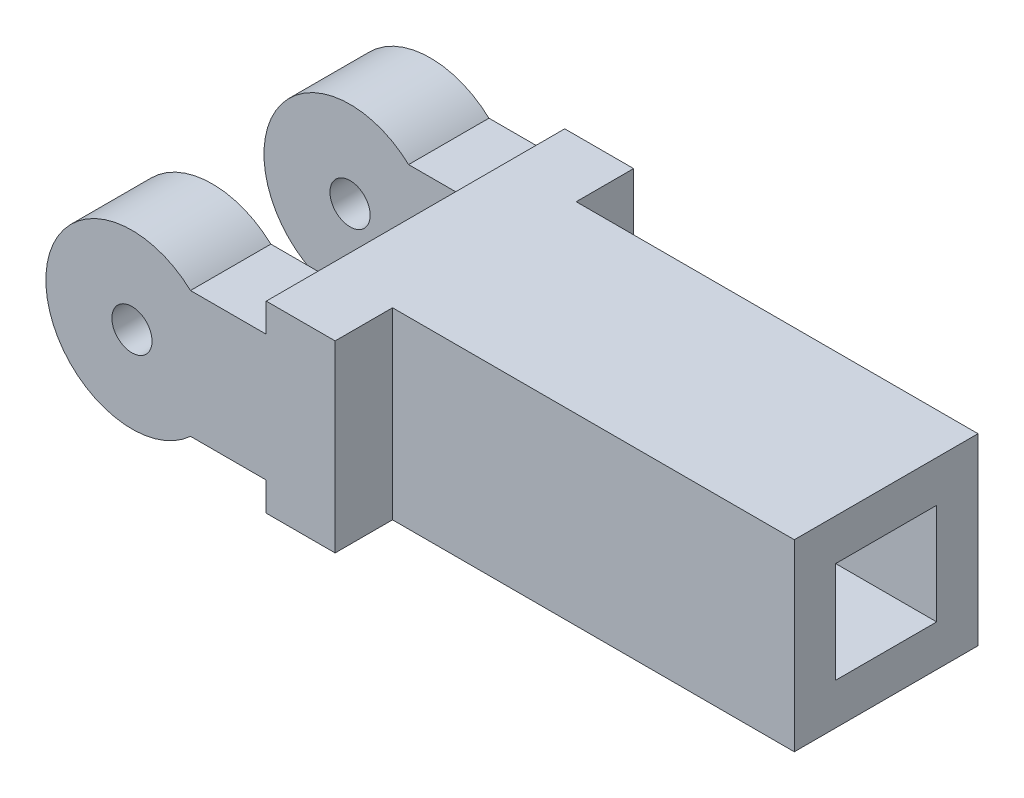
ISO-10303-21;
HEADER;
FILE_DESCRIPTION(('STEP AP214'),'2;1');
FILE_NAME('part.step','',(''),(''),'','','');
FILE_SCHEMA(('AUTOMOTIVE_DESIGN { 1 0 10303 214 1 1 1 1 }'));
ENDSEC;
DATA;
#1=APPLICATION_CONTEXT('core data for automotive mechanical design processes');
#2=APPLICATION_PROTOCOL_DEFINITION('international standard','automotive_design',2000,#1);
#3=PRODUCT_CONTEXT('',#1,'mechanical');
#4=PRODUCT('Part','Part','',(#3));
#5=PRODUCT_RELATED_PRODUCT_CATEGORY('part','',(#4));
#6=PRODUCT_DEFINITION_FORMATION('','',#4);
#7=PRODUCT_DEFINITION_CONTEXT('part definition',#1,'design');
#8=PRODUCT_DEFINITION('design','',#6,#7);
#9=PRODUCT_DEFINITION_SHAPE('','',#8);
#10=(LENGTH_UNIT() NAMED_UNIT(*) SI_UNIT(.MILLI.,.METRE.));
#11=(NAMED_UNIT(*) PLANE_ANGLE_UNIT() SI_UNIT($,.RADIAN.));
#12=(NAMED_UNIT(*) SI_UNIT($,.STERADIAN.) SOLID_ANGLE_UNIT());
#13=UNCERTAINTY_MEASURE_WITH_UNIT(LENGTH_MEASURE(1.E-05),#10,'distance_accuracy_value','');
#14=(GEOMETRIC_REPRESENTATION_CONTEXT(3) GLOBAL_UNCERTAINTY_ASSIGNED_CONTEXT((#13)) GLOBAL_UNIT_ASSIGNED_CONTEXT((#10,
#11,#12)) REPRESENTATION_CONTEXT('',''));
#15=CARTESIAN_POINT('',(0.,0.,0.));
#16=DIRECTION('',(0.,0.,1.));
#17=DIRECTION('',(1.,0.,0.));
#18=AXIS2_PLACEMENT_3D('',#15,#16,#17);
#19=CARTESIAN_POINT('',(7.,-1.6,-1.6));
#20=DIRECTION('',(0.,0.,1.));
#21=DIRECTION('',(1.,0.,0.));
#22=AXIS2_PLACEMENT_3D('',#19,#20,#21);
#23=PLANE('',#22);
#24=DIRECTION('',(0.,-1.,0.));
#25=VECTOR('',#24,1.);
#26=CARTESIAN_POINT('',(0.,-1.6,-1.6));
#27=LINE('',#26,#25);
#28=CARTESIAN_POINT('',(0.,1.6,-1.6));
#29=VERTEX_POINT('',#28);
#30=CARTESIAN_POINT('',(0.,-1.6,-1.6));
#31=VERTEX_POINT('',#30);
#32=EDGE_CURVE('E205',#29,#31,#27,.T.);
#33=ORIENTED_EDGE('',*,*,#32,.F.);
#34=DIRECTION('',(-1.,0.,0.));
#35=VECTOR('',#34,1.);
#36=CARTESIAN_POINT('',(7.,1.6,-1.6));
#37=LINE('',#36,#35);
#38=CARTESIAN_POINT('',(7.,1.6,-1.6));
#39=VERTEX_POINT('',#38);
#40=EDGE_CURVE('E182',#39,#29,#37,.T.);
#41=ORIENTED_EDGE('',*,*,#40,.F.);
#42=DIRECTION('',(0.,1.,0.));
#43=VECTOR('',#42,1.);
#44=CARTESIAN_POINT('',(7.,-1.6,-1.6));
#45=LINE('',#44,#43);
#46=CARTESIAN_POINT('',(7.,-1.6,-1.6));
#47=VERTEX_POINT('',#46);
#48=EDGE_CURVE('E297',#47,#39,#45,.T.);
#49=ORIENTED_EDGE('',*,*,#48,.F.);
#50=DIRECTION('',(-1.,0.,0.));
#51=VECTOR('',#50,1.);
#52=CARTESIAN_POINT('',(7.,-1.6,-1.6));
#53=LINE('',#52,#51);
#54=EDGE_CURVE('E306',#47,#31,#53,.T.);
#55=ORIENTED_EDGE('',*,*,#54,.T.);
#56=EDGE_LOOP('',(#33,#41,#49,#55));
#57=FACE_BOUND('',#56,.T.);
#58=ADVANCED_FACE('F37',(#57),#23,.F.);
#59=CARTESIAN_POINT('',(7.,-1.6,1.6));
#60=DIRECTION('',(0.,0.,-1.));
#61=DIRECTION('',(-1.,0.,0.));
#62=AXIS2_PLACEMENT_3D('',#59,#60,#61);
#63=PLANE('',#62);
#64=DIRECTION('',(0.,1.,0.));
#65=VECTOR('',#64,1.);
#66=CARTESIAN_POINT('',(0.,-1.6,1.6));
#67=LINE('',#66,#65);
#68=CARTESIAN_POINT('',(0.,-1.6,1.6));
#69=VERTEX_POINT('',#68);
#70=CARTESIAN_POINT('',(0.,1.6,1.6));
#71=VERTEX_POINT('',#70);
#72=EDGE_CURVE('E58',#69,#71,#67,.T.);
#73=ORIENTED_EDGE('',*,*,#72,.F.);
#74=DIRECTION('',(-1.,0.,0.));
#75=VECTOR('',#74,1.);
#76=CARTESIAN_POINT('',(7.,-1.6,1.6));
#77=LINE('',#76,#75);
#78=CARTESIAN_POINT('',(7.,-1.6,1.6));
#79=VERTEX_POINT('',#78);
#80=EDGE_CURVE('E309',#79,#69,#77,.T.);
#81=ORIENTED_EDGE('',*,*,#80,.F.);
#82=DIRECTION('',(0.,-1.,0.));
#83=VECTOR('',#82,1.);
#84=CARTESIAN_POINT('',(7.,-1.6,1.6));
#85=LINE('',#84,#83);
#86=CARTESIAN_POINT('',(7.,1.6,1.6));
#87=VERTEX_POINT('',#86);
#88=EDGE_CURVE('E302',#87,#79,#85,.T.);
#89=ORIENTED_EDGE('',*,*,#88,.F.);
#90=DIRECTION('',(-1.,0.,0.));
#91=VECTOR('',#90,1.);
#92=CARTESIAN_POINT('',(7.,1.6,1.6));
#93=LINE('',#92,#91);
#94=EDGE_CURVE('E54',#87,#71,#93,.T.);
#95=ORIENTED_EDGE('',*,*,#94,.T.);
#96=EDGE_LOOP('',(#73,#81,#89,#95));
#97=FACE_BOUND('',#96,.T.);
#98=ADVANCED_FACE('F383',(#97),#63,.F.);
#99=CARTESIAN_POINT('',(0.,1.1,-2.6));
#100=DIRECTION('',(0.,1.,0.));
#101=DIRECTION('',(-1.,0.,0.));
#102=AXIS2_PLACEMENT_3D('',#99,#100,#101);
#103=PLANE('',#102);
#104=DIRECTION('',(0.,0.,1.));
#105=VECTOR('',#104,1.);
#106=CARTESIAN_POINT('',(-2.52,1.1,-2.6));
#107=LINE('',#106,#105);
#108=CARTESIAN_POINT('',(-2.52,1.1,-2.6));
#109=VERTEX_POINT('',#108);
#110=CARTESIAN_POINT('',(-2.52,1.1,-1.2));
#111=VERTEX_POINT('',#110);
#112=EDGE_CURVE('E261',#109,#111,#107,.T.);
#113=ORIENTED_EDGE('',*,*,#112,.T.);
#114=DIRECTION('',(-1.,0.,0.));
#115=VECTOR('',#114,1.);
#116=CARTESIAN_POINT('',(-1.2,1.1,-1.2));
#117=LINE('',#116,#115);
#118=CARTESIAN_POINT('',(-1.2,1.1,-1.2));
#119=VERTEX_POINT('',#118);
#120=EDGE_CURVE('E216',#119,#111,#117,.T.);
#121=ORIENTED_EDGE('',*,*,#120,.F.);
#122=DIRECTION('',(0.,0.,1.));
#123=VECTOR('',#122,1.);
#124=CARTESIAN_POINT('',(-1.2,1.1,-2.6));
#125=LINE('',#124,#123);
#126=CARTESIAN_POINT('',(-1.2,1.1,-2.6));
#127=VERTEX_POINT('',#126);
#128=EDGE_CURVE('E45',#127,#119,#125,.T.);
#129=ORIENTED_EDGE('',*,*,#128,.F.);
#130=DIRECTION('',(-1.,0.,0.));
#131=VECTOR('',#130,1.);
#132=CARTESIAN_POINT('',(0.,1.1,-2.6));
#133=LINE('',#132,#131);
#134=EDGE_CURVE('E235',#127,#109,#133,.T.);
#135=ORIENTED_EDGE('',*,*,#134,.T.);
#136=EDGE_LOOP('',(#113,#121,#129,#135));
#137=FACE_BOUND('',#136,.T.);
#138=ADVANCED_FACE('F316',(#137),#103,.T.);
#139=CARTESIAN_POINT('',(0.,-1.1,-2.6));
#140=DIRECTION('',(0.,1.,0.));
#141=DIRECTION('',(0.,0.,1.));
#142=AXIS2_PLACEMENT_3D('',#139,#140,#141);
#143=PLANE('',#142);
#144=DIRECTION('',(1.,0.,0.));
#145=VECTOR('',#144,1.);
#146=CARTESIAN_POINT('',(-2.52,-1.1,-1.2));
#147=LINE('',#146,#145);
#148=CARTESIAN_POINT('',(-2.52,-1.1,-1.2));
#149=VERTEX_POINT('',#148);
#150=CARTESIAN_POINT('',(-1.2,-1.1,-1.2));
#151=VERTEX_POINT('',#150);
#152=EDGE_CURVE('E221',#149,#151,#147,.T.);
#153=ORIENTED_EDGE('',*,*,#152,.F.);
#154=DIRECTION('',(0.,0.,1.));
#155=VECTOR('',#154,1.);
#156=CARTESIAN_POINT('',(-2.52,-1.1,-2.6));
#157=LINE('',#156,#155);
#158=CARTESIAN_POINT('',(-2.52,-1.1,-2.6));
#159=VERTEX_POINT('',#158);
#160=EDGE_CURVE('E257',#159,#149,#157,.T.);
#161=ORIENTED_EDGE('',*,*,#160,.F.);
#162=DIRECTION('',(-1.,0.,0.));
#163=VECTOR('',#162,1.);
#164=CARTESIAN_POINT('',(0.,-1.1,-2.6));
#165=LINE('',#164,#163);
#166=CARTESIAN_POINT('',(-1.2,-1.1,-2.6));
#167=VERTEX_POINT('',#166);
#168=EDGE_CURVE('E242',#167,#159,#165,.T.);
#169=ORIENTED_EDGE('',*,*,#168,.F.);
#170=DIRECTION('',(0.,0.,1.));
#171=VECTOR('',#170,1.);
#172=CARTESIAN_POINT('',(-1.2,-1.1,-2.6));
#173=LINE('',#172,#171);
#174=EDGE_CURVE('E11',#167,#151,#173,.T.);
#175=ORIENTED_EDGE('',*,*,#174,.T.);
#176=EDGE_LOOP('',(#153,#161,#169,#175));
#177=FACE_BOUND('',#176,.T.);
#178=ADVANCED_FACE('F327',(#177),#143,.F.);
#179=CARTESIAN_POINT('',(-3.53980390271856,0.,-2.6));
#180=DIRECTION('',(0.,0.,1.));
#181=DIRECTION('',(1.,0.,0.));
#182=AXIS2_PLACEMENT_3D('',#179,#180,#181);
#183=CYLINDRICAL_SURFACE('',#182,1.5);
#184=ORIENTED_EDGE('',*,*,#160,.T.);
#185=CARTESIAN_POINT('',(-3.53980390271856,0.,-1.2));
#186=DIRECTION('',(0.,0.,1.));
#187=DIRECTION('',(1.,0.,0.));
#188=AXIS2_PLACEMENT_3D('',#185,#186,#187);
#189=CIRCLE('',#188,1.5);
#190=EDGE_CURVE('E219',#111,#149,#189,.T.);
#191=ORIENTED_EDGE('',*,*,#190,.F.);
#192=ORIENTED_EDGE('',*,*,#112,.F.);
#193=CARTESIAN_POINT('',(-3.53980390271856,0.,-2.6));
#194=DIRECTION('',(0.,0.,1.));
#195=DIRECTION('',(1.,0.,0.));
#196=AXIS2_PLACEMENT_3D('',#193,#194,#195);
#197=CIRCLE('',#196,1.5);
#198=EDGE_CURVE('E238',#109,#159,#197,.T.);
#199=ORIENTED_EDGE('',*,*,#198,.T.);
#200=EDGE_LOOP('',(#184,#191,#192,#199));
#201=FACE_BOUND('',#200,.T.);
#202=ADVANCED_FACE('F322',(#201),#183,.T.);
#203=CARTESIAN_POINT('',(7.,0.,0.));
#204=DIRECTION('',(-1.,0.,0.));
#205=DIRECTION('',(0.,0.,1.));
#206=AXIS2_PLACEMENT_3D('',#203,#204,#205);
#207=PLANE('',#206);
#208=ORIENTED_EDGE('',*,*,#48,.T.);
#209=DIRECTION('',(0.,0.,1.));
#210=VECTOR('',#209,1.);
#211=CARTESIAN_POINT('',(7.,1.6,1.6));
#212=LINE('',#211,#210);
#213=EDGE_CURVE('E300',#39,#87,#212,.T.);
#214=ORIENTED_EDGE('',*,*,#213,.T.);
#215=ORIENTED_EDGE('',*,*,#88,.T.);
#216=DIRECTION('',(0.,0.,-1.));
#217=VECTOR('',#216,1.);
#218=CARTESIAN_POINT('',(7.,-1.6,1.6));
#219=LINE('',#218,#217);
#220=EDGE_CURVE('E304',#79,#47,#219,.T.);
#221=ORIENTED_EDGE('',*,*,#220,.T.);
#222=EDGE_LOOP('',(#208,#214,#215,#221));
#223=FACE_BOUND('',#222,.T.);
#224=DIRECTION('',(0.,1.,0.));
#225=VECTOR('',#224,1.);
#226=CARTESIAN_POINT('',(7.,-0.88,-0.88));
#227=LINE('',#226,#225);
#228=CARTESIAN_POINT('',(7.,-0.88,-0.88));
#229=VERTEX_POINT('',#228);
#230=CARTESIAN_POINT('',(7.,0.88,-0.88));
#231=VERTEX_POINT('',#230);
#232=EDGE_CURVE('E268',#229,#231,#227,.T.);
#233=ORIENTED_EDGE('',*,*,#232,.F.);
#234=DIRECTION('',(0.,0.,-1.));
#235=VECTOR('',#234,1.);
#236=CARTESIAN_POINT('',(7.,-0.88,0.880000000000001));
#237=LINE('',#236,#235);
#238=CARTESIAN_POINT('',(7.,-0.88,0.880000000000001));
#239=VERTEX_POINT('',#238);
#240=EDGE_CURVE('E276',#239,#229,#237,.T.);
#241=ORIENTED_EDGE('',*,*,#240,.F.);
#242=DIRECTION('',(0.,-1.,0.));
#243=VECTOR('',#242,1.);
#244=CARTESIAN_POINT('',(7.,-0.88,0.880000000000001));
#245=LINE('',#244,#243);
#246=CARTESIAN_POINT('',(7.,0.88,0.880000000000001));
#247=VERTEX_POINT('',#246);
#248=EDGE_CURVE('E273',#247,#239,#245,.T.);
#249=ORIENTED_EDGE('',*,*,#248,.F.);
#250=DIRECTION('',(0.,0.,1.));
#251=VECTOR('',#250,1.);
#252=CARTESIAN_POINT('',(7.,0.88,0.880000000000001));
#253=LINE('',#252,#251);
#254=EDGE_CURVE('E270',#231,#247,#253,.T.);
#255=ORIENTED_EDGE('',*,*,#254,.F.);
#256=EDGE_LOOP('',(#233,#241,#249,#255));
#257=FACE_BOUND('',#256,.T.);
#258=ADVANCED_FACE('F393',(#223,#257),#207,.F.);
#259=CARTESIAN_POINT('',(7.,1.6,1.6));
#260=DIRECTION('',(0.,-1.,0.));
#261=DIRECTION('',(0.,0.,-1.));
#262=AXIS2_PLACEMENT_3D('',#259,#260,#261);
#263=PLANE('',#262);
#264=DIRECTION('',(0.,0.,-1.));
#265=VECTOR('',#264,1.);
#266=CARTESIAN_POINT('',(-1.2,1.6,1.6));
#267=LINE('',#266,#265);
#268=CARTESIAN_POINT('',(-1.2,1.6,2.6));
#269=VERTEX_POINT('',#268);
#270=CARTESIAN_POINT('',(-1.2,1.6,-2.6));
#271=VERTEX_POINT('',#270);
#272=EDGE_CURVE('E254',#269,#271,#267,.T.);
#273=ORIENTED_EDGE('',*,*,#272,.F.);
#274=DIRECTION('',(-1.,0.,0.));
#275=VECTOR('',#274,1.);
#276=CARTESIAN_POINT('',(0.,1.6,2.6));
#277=LINE('',#276,#275);
#278=CARTESIAN_POINT('',(0.,1.6,2.6));
#279=VERTEX_POINT('',#278);
#280=EDGE_CURVE('E203',#279,#269,#277,.T.);
#281=ORIENTED_EDGE('',*,*,#280,.F.);
#282=DIRECTION('',(0.,0.,1.));
#283=VECTOR('',#282,1.);
#284=CARTESIAN_POINT('',(0.,1.6,2.6));
#285=LINE('',#284,#283);
#286=EDGE_CURVE('E186',#71,#279,#285,.T.);
#287=ORIENTED_EDGE('',*,*,#286,.F.);
#288=ORIENTED_EDGE('',*,*,#94,.F.);
#289=ORIENTED_EDGE('',*,*,#213,.F.);
#290=ORIENTED_EDGE('',*,*,#40,.T.);
#291=CARTESIAN_POINT('',(0.,1.6,-2.6));
#292=VERTEX_POINT('',#291);
#293=EDGE_CURVE('E176',#292,#29,#285,.T.);
#294=ORIENTED_EDGE('',*,*,#293,.F.);
#295=DIRECTION('',(-1.,0.,0.));
#296=VECTOR('',#295,1.);
#297=CARTESIAN_POINT('',(0.,1.6,-2.6));
#298=LINE('',#297,#296);
#299=EDGE_CURVE('E180',#292,#271,#298,.T.);
#300=ORIENTED_EDGE('',*,*,#299,.T.);
#301=EDGE_LOOP('',(#273,#281,#287,#288,#289,#290,#294,#300));
#302=FACE_BOUND('',#301,.T.);
#303=ADVANCED_FACE('F178',(#302),#263,.F.);
#304=CARTESIAN_POINT('',(7.,-1.6,1.6));
#305=DIRECTION('',(0.,1.,0.));
#306=DIRECTION('',(0.,0.,1.));
#307=AXIS2_PLACEMENT_3D('',#304,#305,#306);
#308=PLANE('',#307);
#309=DIRECTION('',(0.,0.,1.));
#310=VECTOR('',#309,1.);
#311=CARTESIAN_POINT('',(-1.2,-1.6,-1.6));
#312=LINE('',#311,#310);
#313=CARTESIAN_POINT('',(-1.2,-1.6,-2.6));
#314=VERTEX_POINT('',#313);
#315=CARTESIAN_POINT('',(-1.2,-1.6,2.6));
#316=VERTEX_POINT('',#315);
#317=EDGE_CURVE('E265',#314,#316,#312,.T.);
#318=ORIENTED_EDGE('',*,*,#317,.F.);
#319=DIRECTION('',(-1.,0.,0.));
#320=VECTOR('',#319,1.);
#321=CARTESIAN_POINT('',(0.,-1.6,-2.6));
#322=LINE('',#321,#320);
#323=CARTESIAN_POINT('',(0.,-1.6,-2.6));
#324=VERTEX_POINT('',#323);
#325=EDGE_CURVE('E331',#324,#314,#322,.T.);
#326=ORIENTED_EDGE('',*,*,#325,.F.);
#327=DIRECTION('',(0.,0.,-1.));
#328=VECTOR('',#327,1.);
#329=CARTESIAN_POINT('',(0.,-1.6,2.6));
#330=LINE('',#329,#328);
#331=EDGE_CURVE('E192',#31,#324,#330,.T.);
#332=ORIENTED_EDGE('',*,*,#331,.F.);
#333=ORIENTED_EDGE('',*,*,#54,.F.);
#334=ORIENTED_EDGE('',*,*,#220,.F.);
#335=ORIENTED_EDGE('',*,*,#80,.T.);
#336=CARTESIAN_POINT('',(0.,-1.6,2.6));
#337=VERTEX_POINT('',#336);
#338=EDGE_CURVE('E338',#337,#69,#330,.T.);
#339=ORIENTED_EDGE('',*,*,#338,.F.);
#340=DIRECTION('',(-1.,0.,0.));
#341=VECTOR('',#340,1.);
#342=CARTESIAN_POINT('',(0.,-1.6,2.6));
#343=LINE('',#342,#341);
#344=EDGE_CURVE('E208',#337,#316,#343,.T.);
#345=ORIENTED_EDGE('',*,*,#344,.T.);
#346=EDGE_LOOP('',(#318,#326,#332,#333,#334,#335,#339,#345));
#347=FACE_BOUND('',#346,.T.);
#348=ADVANCED_FACE('F346',(#347),#308,.F.);
#349=CARTESIAN_POINT('',(7.,-0.88,-0.88));
#350=DIRECTION('',(0.,0.,1.));
#351=DIRECTION('',(1.,0.,0.));
#352=AXIS2_PLACEMENT_3D('',#349,#350,#351);
#353=PLANE('',#352);
#354=DIRECTION('',(0.,1.,0.));
#355=VECTOR('',#354,1.);
#356=CARTESIAN_POINT('',(0.,-0.88,-0.88));
#357=LINE('',#356,#355);
#358=CARTESIAN_POINT('',(0.,-0.88,-0.88));
#359=VERTEX_POINT('',#358);
#360=CARTESIAN_POINT('',(0.,0.88,-0.88));
#361=VERTEX_POINT('',#360);
#362=EDGE_CURVE('E267',#359,#361,#357,.T.);
#363=ORIENTED_EDGE('',*,*,#362,.F.);
#364=DIRECTION('',(-1.,0.,0.));
#365=VECTOR('',#364,1.);
#366=CARTESIAN_POINT('',(7.,-0.88,-0.88));
#367=LINE('',#366,#365);
#368=EDGE_CURVE('E278',#229,#359,#367,.T.);
#369=ORIENTED_EDGE('',*,*,#368,.F.);
#370=ORIENTED_EDGE('',*,*,#232,.T.);
#371=DIRECTION('',(-1.,0.,0.));
#372=VECTOR('',#371,1.);
#373=CARTESIAN_POINT('',(7.,0.88,-0.88));
#374=LINE('',#373,#372);
#375=EDGE_CURVE('E294',#231,#361,#374,.T.);
#376=ORIENTED_EDGE('',*,*,#375,.T.);
#377=EDGE_LOOP('',(#363,#369,#370,#376));
#378=FACE_BOUND('',#377,.T.);
#379=ADVANCED_FACE('F405',(#378),#353,.T.);
#380=CARTESIAN_POINT('',(7.,0.88,0.880000000000001));
#381=DIRECTION('',(0.,-1.,0.));
#382=DIRECTION('',(0.,0.,-1.));
#383=AXIS2_PLACEMENT_3D('',#380,#381,#382);
#384=PLANE('',#383);
#385=DIRECTION('',(0.,0.,1.));
#386=VECTOR('',#385,1.);
#387=CARTESIAN_POINT('',(0.,0.88,0.880000000000001));
#388=LINE('',#387,#386);
#389=CARTESIAN_POINT('',(0.,0.88,0.880000000000001));
#390=VERTEX_POINT('',#389);
#391=EDGE_CURVE('E281',#361,#390,#388,.T.);
#392=ORIENTED_EDGE('',*,*,#391,.F.);
#393=ORIENTED_EDGE('',*,*,#375,.F.);
#394=ORIENTED_EDGE('',*,*,#254,.T.);
#395=DIRECTION('',(-1.,0.,0.));
#396=VECTOR('',#395,1.);
#397=CARTESIAN_POINT('',(7.,0.88,0.880000000000001));
#398=LINE('',#397,#396);
#399=EDGE_CURVE('E292',#247,#390,#398,.T.);
#400=ORIENTED_EDGE('',*,*,#399,.T.);
#401=EDGE_LOOP('',(#392,#393,#394,#400));
#402=FACE_BOUND('',#401,.T.);
#403=ADVANCED_FACE('F407',(#402),#384,.T.);
#404=CARTESIAN_POINT('',(7.,-0.88,0.880000000000001));
#405=DIRECTION('',(0.,0.,-1.));
#406=DIRECTION('',(-1.,0.,0.));
#407=AXIS2_PLACEMENT_3D('',#404,#405,#406);
#408=PLANE('',#407);
#409=DIRECTION('',(0.,-1.,0.));
#410=VECTOR('',#409,1.);
#411=CARTESIAN_POINT('',(0.,-0.88,0.880000000000001));
#412=LINE('',#411,#410);
#413=CARTESIAN_POINT('',(0.,-0.88,0.880000000000001));
#414=VERTEX_POINT('',#413);
#415=EDGE_CURVE('E284',#390,#414,#412,.T.);
#416=ORIENTED_EDGE('',*,*,#415,.F.);
#417=ORIENTED_EDGE('',*,*,#399,.F.);
#418=ORIENTED_EDGE('',*,*,#248,.T.);
#419=DIRECTION('',(-1.,0.,0.));
#420=VECTOR('',#419,1.);
#421=CARTESIAN_POINT('',(7.,-0.88,0.880000000000001));
#422=LINE('',#421,#420);
#423=EDGE_CURVE('E290',#239,#414,#422,.T.);
#424=ORIENTED_EDGE('',*,*,#423,.T.);
#425=EDGE_LOOP('',(#416,#417,#418,#424));
#426=FACE_BOUND('',#425,.T.);
#427=ADVANCED_FACE('F416',(#426),#408,.T.);
#428=CARTESIAN_POINT('',(7.,-0.88,0.880000000000001));
#429=DIRECTION('',(0.,1.,0.));
#430=DIRECTION('',(0.,0.,1.));
#431=AXIS2_PLACEMENT_3D('',#428,#429,#430);
#432=PLANE('',#431);
#433=DIRECTION('',(0.,0.,-1.));
#434=VECTOR('',#433,1.);
#435=CARTESIAN_POINT('',(0.,-0.88,0.880000000000001));
#436=LINE('',#435,#434);
#437=EDGE_CURVE('E271',#414,#359,#436,.T.);
#438=ORIENTED_EDGE('',*,*,#437,.F.);
#439=ORIENTED_EDGE('',*,*,#423,.F.);
#440=ORIENTED_EDGE('',*,*,#240,.T.);
#441=ORIENTED_EDGE('',*,*,#368,.T.);
#442=EDGE_LOOP('',(#438,#439,#440,#441));
#443=FACE_BOUND('',#442,.T.);
#444=ADVANCED_FACE('F414',(#443),#432,.T.);
#445=CARTESIAN_POINT('',(0.,0.,0.));
#446=DIRECTION('',(-1.,0.,0.));
#447=DIRECTION('',(0.,0.,1.));
#448=AXIS2_PLACEMENT_3D('',#445,#446,#447);
#449=PLANE('',#448);
#450=ORIENTED_EDGE('',*,*,#362,.T.);
#451=ORIENTED_EDGE('',*,*,#391,.T.);
#452=ORIENTED_EDGE('',*,*,#415,.T.);
#453=ORIENTED_EDGE('',*,*,#437,.T.);
#454=EDGE_LOOP('',(#450,#451,#452,#453));
#455=FACE_BOUND('',#454,.T.);
#456=ADVANCED_FACE('F411',(#455),#449,.F.);
#457=CARTESIAN_POINT('',(-1.2,0.,0.));
#458=DIRECTION('',(-1.,0.,0.));
#459=DIRECTION('',(0.,0.,1.));
#460=AXIS2_PLACEMENT_3D('',#457,#458,#459);
#461=PLANE('',#460);
#462=ORIENTED_EDGE('',*,*,#174,.F.);
#463=DIRECTION('',(0.,1.,0.));
#464=VECTOR('',#463,1.);
#465=CARTESIAN_POINT('',(-1.2,-1.6,-2.6));
#466=LINE('',#465,#464);
#467=EDGE_CURVE('E330',#314,#167,#466,.T.);
#468=ORIENTED_EDGE('',*,*,#467,.F.);
#469=ORIENTED_EDGE('',*,*,#317,.T.);
#470=DIRECTION('',(0.,-1.,0.));
#471=VECTOR('',#470,1.);
#472=CARTESIAN_POINT('',(-1.2,-1.6,2.6));
#473=LINE('',#472,#471);
#474=CARTESIAN_POINT('',(-1.2,-1.1,2.6));
#475=VERTEX_POINT('',#474);
#476=EDGE_CURVE('E332',#475,#316,#473,.T.);
#477=ORIENTED_EDGE('',*,*,#476,.F.);
#478=CARTESIAN_POINT('',(-1.2,-1.1,1.2));
#479=VERTEX_POINT('',#478);
#480=EDGE_CURVE('E47',#479,#475,#173,.T.);
#481=ORIENTED_EDGE('',*,*,#480,.F.);
#482=DIRECTION('',(0.,1.,0.));
#483=VECTOR('',#482,1.);
#484=CARTESIAN_POINT('',(-1.2,-1.1,1.2));
#485=LINE('',#484,#483);
#486=CARTESIAN_POINT('',(-1.2,1.1,1.2));
#487=VERTEX_POINT('',#486);
#488=EDGE_CURVE('E213',#479,#487,#485,.T.);
#489=ORIENTED_EDGE('',*,*,#488,.T.);
#490=CARTESIAN_POINT('',(-1.2,1.1,2.6));
#491=VERTEX_POINT('',#490);
#492=EDGE_CURVE('E252',#487,#491,#125,.T.);
#493=ORIENTED_EDGE('',*,*,#492,.T.);
#494=EDGE_CURVE('E196',#269,#491,#473,.T.);
#495=ORIENTED_EDGE('',*,*,#494,.F.);
#496=ORIENTED_EDGE('',*,*,#272,.T.);
#497=EDGE_CURVE('E202',#127,#271,#466,.T.);
#498=ORIENTED_EDGE('',*,*,#497,.F.);
#499=ORIENTED_EDGE('',*,*,#128,.T.);
#500=DIRECTION('',(0.,1.,0.));
#501=VECTOR('',#500,1.);
#502=CARTESIAN_POINT('',(-1.2,-1.1,-1.2));
#503=LINE('',#502,#501);
#504=EDGE_CURVE('E214',#151,#119,#503,.T.);
#505=ORIENTED_EDGE('',*,*,#504,.F.);
#506=EDGE_LOOP('',(#462,#468,#469,#477,#481,#489,#493,#495,#496,#498,#499,#505));
#507=FACE_BOUND('',#506,.T.);
#508=ADVANCED_FACE('F313',(#507),#461,.T.);
#509=DIRECTION('',(-1.,0.,0.));
#510=VECTOR('',#509,1.);
#511=CARTESIAN_POINT('',(-1.2,1.1,1.2));
#512=LINE('',#511,#510);
#513=CARTESIAN_POINT('',(-2.52,1.1,1.2));
#514=VERTEX_POINT('',#513);
#515=EDGE_CURVE('E227',#487,#514,#512,.T.);
#516=ORIENTED_EDGE('',*,*,#515,.T.);
#517=CARTESIAN_POINT('',(-2.52,1.1,2.6));
#518=VERTEX_POINT('',#517);
#519=EDGE_CURVE('E244',#514,#518,#107,.T.);
#520=ORIENTED_EDGE('',*,*,#519,.T.);
#521=DIRECTION('',(-1.,0.,0.));
#522=VECTOR('',#521,1.);
#523=CARTESIAN_POINT('',(0.,1.1,2.6));
#524=LINE('',#523,#522);
#525=EDGE_CURVE('E224',#491,#518,#524,.T.);
#526=ORIENTED_EDGE('',*,*,#525,.F.);
#527=ORIENTED_EDGE('',*,*,#492,.F.);
#528=EDGE_LOOP('',(#516,#520,#526,#527));
#529=FACE_BOUND('',#528,.T.);
#530=ADVANCED_FACE('F364',(#529),#103,.T.);
#531=CARTESIAN_POINT('',(-2.52,-1.1,1.2));
#532=VERTEX_POINT('',#531);
#533=CARTESIAN_POINT('',(-2.52,-1.1,2.6));
#534=VERTEX_POINT('',#533);
#535=EDGE_CURVE('E260',#532,#534,#157,.T.);
#536=ORIENTED_EDGE('',*,*,#535,.F.);
#537=DIRECTION('',(1.,0.,0.));
#538=VECTOR('',#537,1.);
#539=CARTESIAN_POINT('',(-2.52,-1.1,1.2));
#540=LINE('',#539,#538);
#541=EDGE_CURVE('E217',#532,#479,#540,.T.);
#542=ORIENTED_EDGE('',*,*,#541,.T.);
#543=ORIENTED_EDGE('',*,*,#480,.T.);
#544=DIRECTION('',(-1.,0.,0.));
#545=VECTOR('',#544,1.);
#546=CARTESIAN_POINT('',(0.,-1.1,2.6));
#547=LINE('',#546,#545);
#548=EDGE_CURVE('E239',#475,#534,#547,.T.);
#549=ORIENTED_EDGE('',*,*,#548,.T.);
#550=EDGE_LOOP('',(#536,#542,#543,#549));
#551=FACE_BOUND('',#550,.T.);
#552=ADVANCED_FACE('F358',(#551),#143,.F.);
#553=CARTESIAN_POINT('',(-3.53980390271856,0.,1.2));
#554=DIRECTION('',(0.,0.,1.));
#555=DIRECTION('',(1.,0.,0.));
#556=AXIS2_PLACEMENT_3D('',#553,#554,#555);
#557=CIRCLE('',#556,1.5);
#558=EDGE_CURVE('E230',#514,#532,#557,.T.);
#559=ORIENTED_EDGE('',*,*,#558,.T.);
#560=ORIENTED_EDGE('',*,*,#535,.T.);
#561=CARTESIAN_POINT('',(-3.53980390271856,0.,2.6));
#562=DIRECTION('',(0.,0.,1.));
#563=DIRECTION('',(1.,0.,0.));
#564=AXIS2_PLACEMENT_3D('',#561,#562,#563);
#565=CIRCLE('',#564,1.5);
#566=EDGE_CURVE('E247',#518,#534,#565,.T.);
#567=ORIENTED_EDGE('',*,*,#566,.F.);
#568=ORIENTED_EDGE('',*,*,#519,.F.);
#569=EDGE_LOOP('',(#559,#560,#567,#568));
#570=FACE_BOUND('',#569,.T.);
#571=ADVANCED_FACE('F361',(#570),#183,.T.);
#572=CARTESIAN_POINT('',(0.,0.,-2.6));
#573=DIRECTION('',(0.,0.,1.));
#574=DIRECTION('',(1.,0.,0.));
#575=AXIS2_PLACEMENT_3D('',#572,#573,#574);
#576=PLANE('',#575);
#577=CARTESIAN_POINT('',(-3.53980390271856,0.,-2.6));
#578=DIRECTION('',(0.,0.,-1.));
#579=DIRECTION('',(-1.,0.,0.));
#580=AXIS2_PLACEMENT_3D('',#577,#578,#579);
#581=CIRCLE('',#580,0.35);
#582=CARTESIAN_POINT('',(-3.88980390271856,0.,-2.6));
#583=VERTEX_POINT('',#582);
#584=EDGE_CURVE('E604',#583,#583,#581,.T.);
#585=ORIENTED_EDGE('',*,*,#584,.F.);
#586=EDGE_LOOP('',(#585));
#587=FACE_BOUND('',#586,.T.);
#588=ORIENTED_EDGE('',*,*,#134,.F.);
#589=ORIENTED_EDGE('',*,*,#497,.T.);
#590=ORIENTED_EDGE('',*,*,#299,.F.);
#591=DIRECTION('',(0.,1.,0.));
#592=VECTOR('',#591,1.);
#593=CARTESIAN_POINT('',(0.,-1.6,-2.6));
#594=LINE('',#593,#592);
#595=EDGE_CURVE('E189',#324,#292,#594,.T.);
#596=ORIENTED_EDGE('',*,*,#595,.F.);
#597=ORIENTED_EDGE('',*,*,#325,.T.);
#598=ORIENTED_EDGE('',*,*,#467,.T.);
#599=ORIENTED_EDGE('',*,*,#168,.T.);
#600=ORIENTED_EDGE('',*,*,#198,.F.);
#601=EDGE_LOOP('',(#588,#589,#590,#596,#597,#598,#599,#600));
#602=FACE_BOUND('',#601,.T.);
#603=ADVANCED_FACE('F200',(#587,#602),#576,.F.);
#604=CARTESIAN_POINT('',(0.,0.,2.6));
#605=DIRECTION('',(0.,0.,1.));
#606=DIRECTION('',(1.,0.,0.));
#607=AXIS2_PLACEMENT_3D('',#604,#605,#606);
#608=PLANE('',#607);
#609=CARTESIAN_POINT('',(-3.53980390271856,0.,2.6));
#610=DIRECTION('',(0.,0.,-1.));
#611=DIRECTION('',(-1.,0.,0.));
#612=AXIS2_PLACEMENT_3D('',#609,#610,#611);
#613=CIRCLE('',#612,0.35);
#614=CARTESIAN_POINT('',(-3.88980390271856,0.,2.6));
#615=VERTEX_POINT('',#614);
#616=EDGE_CURVE('E605',#615,#615,#613,.T.);
#617=ORIENTED_EDGE('',*,*,#616,.T.);
#618=EDGE_LOOP('',(#617));
#619=FACE_BOUND('',#618,.T.);
#620=ORIENTED_EDGE('',*,*,#525,.T.);
#621=ORIENTED_EDGE('',*,*,#566,.T.);
#622=ORIENTED_EDGE('',*,*,#548,.F.);
#623=ORIENTED_EDGE('',*,*,#476,.T.);
#624=ORIENTED_EDGE('',*,*,#344,.F.);
#625=DIRECTION('',(0.,-1.,0.));
#626=VECTOR('',#625,1.);
#627=CARTESIAN_POINT('',(0.,-1.6,2.6));
#628=LINE('',#627,#626);
#629=EDGE_CURVE('E185',#279,#337,#628,.T.);
#630=ORIENTED_EDGE('',*,*,#629,.F.);
#631=ORIENTED_EDGE('',*,*,#280,.T.);
#632=ORIENTED_EDGE('',*,*,#494,.T.);
#633=EDGE_LOOP('',(#620,#621,#622,#623,#624,#630,#631,#632));
#634=FACE_BOUND('',#633,.T.);
#635=ADVANCED_FACE('F350',(#619,#634),#608,.T.);
#636=CARTESIAN_POINT('',(-3.53980390271856,0.,-1.2));
#637=DIRECTION('',(0.,0.,1.));
#638=DIRECTION('',(1.,0.,0.));
#639=AXIS2_PLACEMENT_3D('',#636,#637,#638);
#640=PLANE('',#639);
#641=CARTESIAN_POINT('',(-3.53980390271856,0.,-1.2));
#642=DIRECTION('',(0.,0.,1.));
#643=DIRECTION('',(1.,0.,0.));
#644=AXIS2_PLACEMENT_3D('',#641,#642,#643);
#645=CIRCLE('',#644,0.35);
#646=CARTESIAN_POINT('',(-3.18980390271856,0.,-1.2));
#647=VERTEX_POINT('',#646);
#648=EDGE_CURVE('E336',#647,#647,#645,.T.);
#649=ORIENTED_EDGE('',*,*,#648,.F.);
#650=EDGE_LOOP('',(#649));
#651=FACE_BOUND('',#650,.T.);
#652=ORIENTED_EDGE('',*,*,#504,.T.);
#653=ORIENTED_EDGE('',*,*,#120,.T.);
#654=ORIENTED_EDGE('',*,*,#190,.T.);
#655=ORIENTED_EDGE('',*,*,#152,.T.);
#656=EDGE_LOOP('',(#652,#653,#654,#655));
#657=FACE_BOUND('',#656,.T.);
#658=ADVANCED_FACE('F319',(#651,#657),#640,.T.);
#659=CARTESIAN_POINT('',(-3.53980390271856,0.,1.2));
#660=DIRECTION('',(0.,0.,1.));
#661=DIRECTION('',(1.,0.,0.));
#662=AXIS2_PLACEMENT_3D('',#659,#660,#661);
#663=PLANE('',#662);
#664=CARTESIAN_POINT('',(-3.53980390271856,0.,1.2));
#665=DIRECTION('',(0.,0.,1.));
#666=DIRECTION('',(1.,0.,0.));
#667=AXIS2_PLACEMENT_3D('',#664,#665,#666);
#668=CIRCLE('',#667,0.35);
#669=CARTESIAN_POINT('',(-3.18980390271856,0.,1.2));
#670=VERTEX_POINT('',#669);
#671=EDGE_CURVE('E40',#670,#670,#668,.T.);
#672=ORIENTED_EDGE('',*,*,#671,.T.);
#673=EDGE_LOOP('',(#672));
#674=FACE_BOUND('',#673,.T.);
#675=ORIENTED_EDGE('',*,*,#488,.F.);
#676=ORIENTED_EDGE('',*,*,#541,.F.);
#677=ORIENTED_EDGE('',*,*,#558,.F.);
#678=ORIENTED_EDGE('',*,*,#515,.F.);
#679=EDGE_LOOP('',(#675,#676,#677,#678));
#680=FACE_BOUND('',#679,.T.);
#681=ADVANCED_FACE('F356',(#674,#680),#663,.F.);
#682=CARTESIAN_POINT('',(0.,0.,0.));
#683=DIRECTION('',(-1.,0.,0.));
#684=DIRECTION('',(0.,-1.,0.));
#685=AXIS2_PLACEMENT_3D('',#682,#683,#684);
#686=PLANE('',#685);
#687=ORIENTED_EDGE('',*,*,#338,.T.);
#688=ORIENTED_EDGE('',*,*,#72,.T.);
#689=ORIENTED_EDGE('',*,*,#286,.T.);
#690=ORIENTED_EDGE('',*,*,#629,.T.);
#691=EDGE_LOOP('',(#687,#688,#689,#690));
#692=FACE_BOUND('',#691,.T.);
#693=ADVANCED_FACE('F370',(#692),#686,.F.);
#694=ORIENTED_EDGE('',*,*,#293,.T.);
#695=ORIENTED_EDGE('',*,*,#32,.T.);
#696=ORIENTED_EDGE('',*,*,#331,.T.);
#697=ORIENTED_EDGE('',*,*,#595,.T.);
#698=EDGE_LOOP('',(#694,#695,#696,#697));
#699=FACE_BOUND('',#698,.T.);
#700=ADVANCED_FACE('F190',(#699),#686,.F.);
#701=CARTESIAN_POINT('',(-3.53980390271856,0.,2.6));
#702=DIRECTION('',(0.,0.,-1.));
#703=DIRECTION('',(-1.,0.,0.));
#704=AXIS2_PLACEMENT_3D('',#701,#702,#703);
#705=CYLINDRICAL_SURFACE('',#704,0.35);
#706=ORIENTED_EDGE('',*,*,#616,.F.);
#707=EDGE_LOOP('',(#706));
#708=FACE_BOUND('',#707,.T.);
#709=ORIENTED_EDGE('',*,*,#671,.F.);
#710=EDGE_LOOP('',(#709));
#711=FACE_BOUND('',#710,.T.);
#712=ADVANCED_FACE('F377',(#708,#711),#705,.F.);
#713=ORIENTED_EDGE('',*,*,#648,.T.);
#714=EDGE_LOOP('',(#713));
#715=FACE_BOUND('',#714,.T.);
#716=ORIENTED_EDGE('',*,*,#584,.T.);
#717=EDGE_LOOP('',(#716));
#718=FACE_BOUND('',#717,.T.);
#719=ADVANCED_FACE('F587',(#715,#718),#705,.F.);
#720=CLOSED_SHELL('',(#58,#98,#138,#178,#202,#258,#303,#348,#379,#403,#427,#444,#456,#508,#530,
#552,#571,#603,#635,#658,#681,#693,#700,#712,#719));
#721=MANIFOLD_SOLID_BREP('B2',#720);
#722=ADVANCED_BREP_SHAPE_REPRESENTATION('',(#18,#721),#14);
#723=SHAPE_DEFINITION_REPRESENTATION(#9,#722);
ENDSEC;
END-ISO-10303-21;
